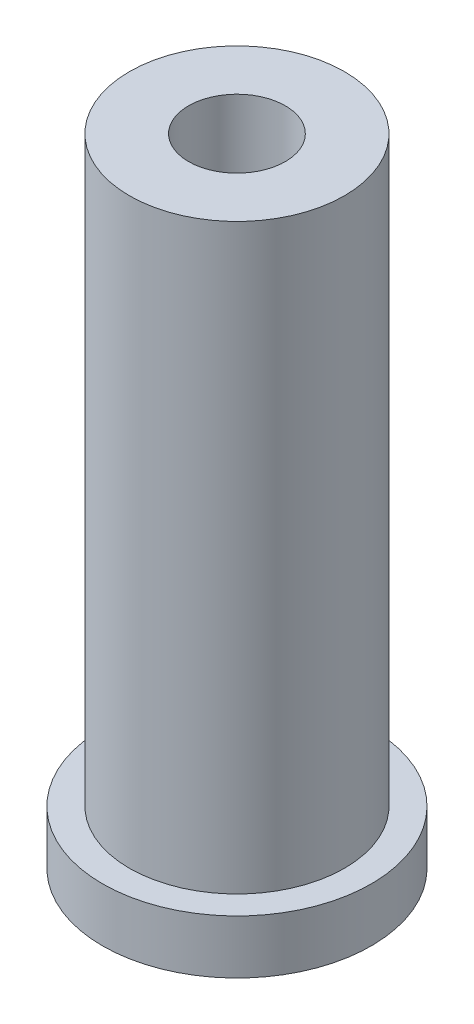
ISO-10303-21;
HEADER;
FILE_DESCRIPTION(('STEP AP214'),'2;1');
FILE_NAME('part.step','',(''),(''),'','','');
FILE_SCHEMA(('AUTOMOTIVE_DESIGN { 1 0 10303 214 1 1 1 1 }'));
ENDSEC;
DATA;
#1=APPLICATION_CONTEXT('core data for automotive mechanical design processes');
#2=APPLICATION_PROTOCOL_DEFINITION('international standard','automotive_design',2000,#1);
#3=PRODUCT_CONTEXT('',#1,'mechanical');
#4=PRODUCT('Part','Part','',(#3));
#5=PRODUCT_RELATED_PRODUCT_CATEGORY('part','',(#4));
#6=PRODUCT_DEFINITION_FORMATION('','',#4);
#7=PRODUCT_DEFINITION_CONTEXT('part definition',#1,'design');
#8=PRODUCT_DEFINITION('design','',#6,#7);
#9=PRODUCT_DEFINITION_SHAPE('','',#8);
#10=(LENGTH_UNIT() NAMED_UNIT(*) SI_UNIT(.MILLI.,.METRE.));
#11=(NAMED_UNIT(*) PLANE_ANGLE_UNIT() SI_UNIT($,.RADIAN.));
#12=(NAMED_UNIT(*) SI_UNIT($,.STERADIAN.) SOLID_ANGLE_UNIT());
#13=UNCERTAINTY_MEASURE_WITH_UNIT(LENGTH_MEASURE(1.E-05),#10,'distance_accuracy_value','');
#14=(GEOMETRIC_REPRESENTATION_CONTEXT(3) GLOBAL_UNCERTAINTY_ASSIGNED_CONTEXT((#13)) GLOBAL_UNIT_ASSIGNED_CONTEXT((#10,
#11,#12)) REPRESENTATION_CONTEXT('',''));
#15=CARTESIAN_POINT('',(0.,0.,0.));
#16=DIRECTION('',(0.,0.,1.));
#17=DIRECTION('',(1.,0.,0.));
#18=AXIS2_PLACEMENT_3D('',#15,#16,#17);
#19=CARTESIAN_POINT('',(0.,3.,0.));
#20=DIRECTION('',(0.,1.,0.));
#21=DIRECTION('',(0.,0.,1.));
#22=AXIS2_PLACEMENT_3D('',#19,#20,#21);
#23=PLANE('',#22);
#24=CARTESIAN_POINT('',(0.,3.,0.));
#25=DIRECTION('',(0.,1.,0.));
#26=DIRECTION('',(0.,0.,1.));
#27=AXIS2_PLACEMENT_3D('',#24,#25,#26);
#28=CIRCLE('',#27,6.);
#29=CARTESIAN_POINT('',(0.,3.,6.));
#30=VERTEX_POINT('',#29);
#31=EDGE_CURVE('E10',#30,#30,#28,.T.);
#32=ORIENTED_EDGE('',*,*,#31,.F.);
#33=EDGE_LOOP('',(#32));
#34=FACE_BOUND('',#33,.T.);
#35=CARTESIAN_POINT('',(0.,3.,0.));
#36=DIRECTION('',(0.,1.,0.));
#37=DIRECTION('',(0.,0.,1.));
#38=AXIS2_PLACEMENT_3D('',#35,#36,#37);
#39=CIRCLE('',#38,7.5);
#40=CARTESIAN_POINT('',(0.,3.,7.5));
#41=VERTEX_POINT('',#40);
#42=EDGE_CURVE('E45',#41,#41,#39,.T.);
#43=ORIENTED_EDGE('',*,*,#42,.T.);
#44=EDGE_LOOP('',(#43));
#45=FACE_BOUND('',#44,.T.);
#46=ADVANCED_FACE('F37',(#34,#45),#23,.T.);
#47=CARTESIAN_POINT('',(0.,0.,0.));
#48=DIRECTION('',(0.,1.,0.));
#49=DIRECTION('',(0.,0.,1.));
#50=AXIS2_PLACEMENT_3D('',#47,#48,#49);
#51=PLANE('',#50);
#52=CARTESIAN_POINT('',(0.,0.,0.));
#53=DIRECTION('',(0.,1.,0.));
#54=DIRECTION('',(0.,0.,1.));
#55=AXIS2_PLACEMENT_3D('',#52,#53,#54);
#56=CIRCLE('',#55,7.5);
#57=CARTESIAN_POINT('',(0.,0.,7.5));
#58=VERTEX_POINT('',#57);
#59=EDGE_CURVE('E50',#58,#58,#56,.T.);
#60=ORIENTED_EDGE('',*,*,#59,.F.);
#61=EDGE_LOOP('',(#60));
#62=FACE_BOUND('',#61,.T.);
#63=CARTESIAN_POINT('',(0.,0.,0.));
#64=DIRECTION('',(0.,1.,0.));
#65=DIRECTION('',(0.,0.,1.));
#66=AXIS2_PLACEMENT_3D('',#63,#64,#65);
#67=CIRCLE('',#66,2.7);
#68=CARTESIAN_POINT('',(0.,0.,2.7));
#69=VERTEX_POINT('',#68);
#70=EDGE_CURVE('E56',#69,#69,#67,.T.);
#71=ORIENTED_EDGE('',*,*,#70,.T.);
#72=EDGE_LOOP('',(#71));
#73=FACE_BOUND('',#72,.T.);
#74=ADVANCED_FACE('F82',(#62,#73),#51,.F.);
#75=CARTESIAN_POINT('',(0.,3.,0.));
#76=DIRECTION('',(0.,-1.,0.));
#77=DIRECTION('',(0.,0.,-1.));
#78=AXIS2_PLACEMENT_3D('',#75,#76,#77);
#79=CYLINDRICAL_SURFACE('',#78,7.5);
#80=ORIENTED_EDGE('',*,*,#42,.F.);
#81=EDGE_LOOP('',(#80));
#82=FACE_BOUND('',#81,.T.);
#83=ORIENTED_EDGE('',*,*,#59,.T.);
#84=EDGE_LOOP('',(#83));
#85=FACE_BOUND('',#84,.T.);
#86=ADVANCED_FACE('F39',(#82,#85),#79,.T.);
#87=CARTESIAN_POINT('',(0.,3.,0.));
#88=DIRECTION('',(0.,-1.,0.));
#89=DIRECTION('',(0.,0.,-1.));
#90=AXIS2_PLACEMENT_3D('',#87,#88,#89);
#91=CYLINDRICAL_SURFACE('',#90,2.7);
#92=CARTESIAN_POINT('',(0.,35.5,0.));
#93=DIRECTION('',(0.,1.,0.));
#94=DIRECTION('',(0.,0.,1.));
#95=AXIS2_PLACEMENT_3D('',#92,#93,#94);
#96=CIRCLE('',#95,2.7);
#97=CARTESIAN_POINT('',(0.,35.5,2.7));
#98=VERTEX_POINT('',#97);
#99=EDGE_CURVE('E61',#98,#98,#96,.T.);
#100=ORIENTED_EDGE('',*,*,#99,.T.);
#101=EDGE_LOOP('',(#100));
#102=FACE_BOUND('',#101,.T.);
#103=ORIENTED_EDGE('',*,*,#70,.F.);
#104=EDGE_LOOP('',(#103));
#105=FACE_BOUND('',#104,.T.);
#106=ADVANCED_FACE('F78',(#102,#105),#91,.F.);
#107=CARTESIAN_POINT('',(0.,35.5,0.));
#108=DIRECTION('',(0.,1.,0.));
#109=DIRECTION('',(0.,0.,1.));
#110=AXIS2_PLACEMENT_3D('',#107,#108,#109);
#111=PLANE('',#110);
#112=ORIENTED_EDGE('',*,*,#99,.F.);
#113=EDGE_LOOP('',(#112));
#114=FACE_BOUND('',#113,.T.);
#115=CARTESIAN_POINT('',(0.,35.5,0.));
#116=DIRECTION('',(0.,1.,0.));
#117=DIRECTION('',(0.,0.,1.));
#118=AXIS2_PLACEMENT_3D('',#115,#116,#117);
#119=CIRCLE('',#118,6.);
#120=CARTESIAN_POINT('',(0.,35.5,6.));
#121=VERTEX_POINT('',#120);
#122=EDGE_CURVE('E65',#121,#121,#119,.T.);
#123=ORIENTED_EDGE('',*,*,#122,.T.);
#124=EDGE_LOOP('',(#123));
#125=FACE_BOUND('',#124,.T.);
#126=ADVANCED_FACE('F70',(#114,#125),#111,.T.);
#127=CARTESIAN_POINT('',(0.,-13.9705627484771,0.));
#128=DIRECTION('',(0.,1.,0.));
#129=DIRECTION('',(0.,0.,1.));
#130=AXIS2_PLACEMENT_3D('',#127,#128,#129);
#131=CYLINDRICAL_SURFACE('',#130,6.);
#132=ORIENTED_EDGE('',*,*,#31,.T.);
#133=EDGE_LOOP('',(#132));
#134=FACE_BOUND('',#133,.T.);
#135=ORIENTED_EDGE('',*,*,#122,.F.);
#136=EDGE_LOOP('',(#135));
#137=FACE_BOUND('',#136,.T.);
#138=ADVANCED_FACE('F72',(#134,#137),#131,.T.);
#139=CLOSED_SHELL('',(#46,#74,#86,#106,#126,#138));
#140=MANIFOLD_SOLID_BREP('B2',#139);
#141=ADVANCED_BREP_SHAPE_REPRESENTATION('',(#18,#140),#14);
#142=SHAPE_DEFINITION_REPRESENTATION(#9,#141);
ENDSEC;
END-ISO-10303-21;
